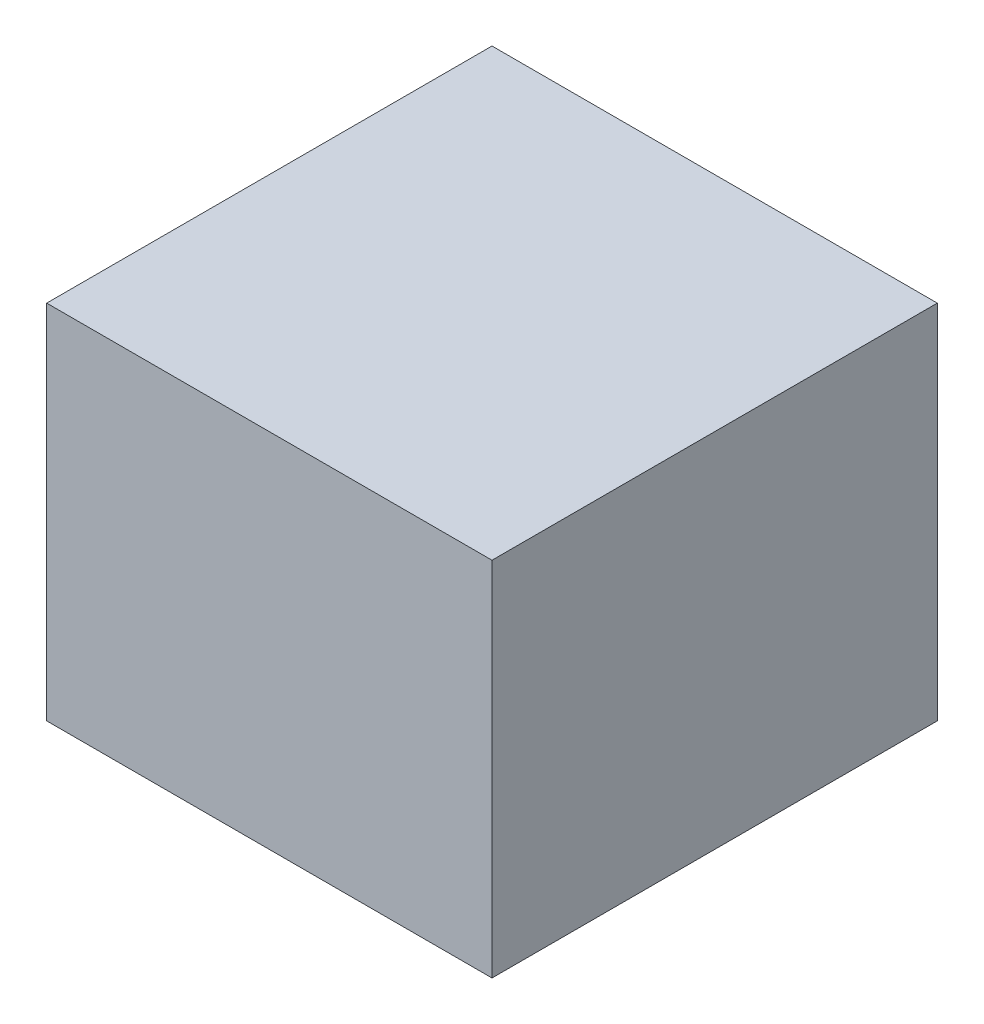
ISO-10303-21;
HEADER;
FILE_DESCRIPTION(('STEP AP214'),'2;1');
FILE_NAME('part.step','',(''),(''),'','','');
FILE_SCHEMA(('AUTOMOTIVE_DESIGN { 1 0 10303 214 1 1 1 1 }'));
ENDSEC;
DATA;
#1=APPLICATION_CONTEXT('core data for automotive mechanical design processes');
#2=APPLICATION_PROTOCOL_DEFINITION('international standard','automotive_design',2000,#1);
#3=PRODUCT_CONTEXT('',#1,'mechanical');
#4=PRODUCT('Part','Part','',(#3));
#5=PRODUCT_RELATED_PRODUCT_CATEGORY('part','',(#4));
#6=PRODUCT_DEFINITION_FORMATION('','',#4);
#7=PRODUCT_DEFINITION_CONTEXT('part definition',#1,'design');
#8=PRODUCT_DEFINITION('design','',#6,#7);
#9=PRODUCT_DEFINITION_SHAPE('','',#8);
#10=(LENGTH_UNIT() NAMED_UNIT(*) SI_UNIT(.MILLI.,.METRE.));
#11=(NAMED_UNIT(*) PLANE_ANGLE_UNIT() SI_UNIT($,.RADIAN.));
#12=(NAMED_UNIT(*) SI_UNIT($,.STERADIAN.) SOLID_ANGLE_UNIT());
#13=UNCERTAINTY_MEASURE_WITH_UNIT(LENGTH_MEASURE(1.E-05),#10,'distance_accuracy_value','');
#14=(GEOMETRIC_REPRESENTATION_CONTEXT(3) GLOBAL_UNCERTAINTY_ASSIGNED_CONTEXT((#13)) GLOBAL_UNIT_ASSIGNED_CONTEXT((#10,
#11,#12)) REPRESENTATION_CONTEXT('',''));
#15=CARTESIAN_POINT('',(0.,0.,0.));
#16=DIRECTION('',(0.,0.,1.));
#17=DIRECTION('',(1.,0.,0.));
#18=AXIS2_PLACEMENT_3D('',#15,#16,#17);
#19=CARTESIAN_POINT('',(80.,-30.,-80.));
#20=DIRECTION('',(1.,0.,0.));
#21=DIRECTION('',(0.,0.,-1.));
#22=AXIS2_PLACEMENT_3D('',#19,#20,#21);
#23=PLANE('',#22);
#24=DIRECTION('',(0.,1.,0.));
#25=VECTOR('',#24,1.);
#26=CARTESIAN_POINT('',(80.,-30.,-80.));
#27=LINE('',#26,#25);
#28=CARTESIAN_POINT('',(80.,-30.,-80.));
#29=VERTEX_POINT('',#28);
#30=CARTESIAN_POINT('',(80.,100.,-80.));
#31=VERTEX_POINT('',#30);
#32=EDGE_CURVE('E38',#29,#31,#27,.T.);
#33=ORIENTED_EDGE('',*,*,#32,.T.);
#34=DIRECTION('',(0.,0.,-1.));
#35=VECTOR('',#34,1.);
#36=CARTESIAN_POINT('',(80.,100.,-80.));
#37=LINE('',#36,#35);
#38=CARTESIAN_POINT('',(80.,100.,80.));
#39=VERTEX_POINT('',#38);
#40=EDGE_CURVE('E75',#39,#31,#37,.T.);
#41=ORIENTED_EDGE('',*,*,#40,.F.);
#42=DIRECTION('',(0.,1.,0.));
#43=VECTOR('',#42,1.);
#44=CARTESIAN_POINT('',(80.,-30.,80.));
#45=LINE('',#44,#43);
#46=CARTESIAN_POINT('',(80.,-30.,80.));
#47=VERTEX_POINT('',#46);
#48=EDGE_CURVE('E11',#47,#39,#45,.T.);
#49=ORIENTED_EDGE('',*,*,#48,.F.);
#50=DIRECTION('',(0.,0.,-1.));
#51=VECTOR('',#50,1.);
#52=CARTESIAN_POINT('',(80.,-30.,-80.));
#53=LINE('',#52,#51);
#54=EDGE_CURVE('E76',#47,#29,#53,.T.);
#55=ORIENTED_EDGE('',*,*,#54,.T.);
#56=EDGE_LOOP('',(#33,#41,#49,#55));
#57=FACE_BOUND('',#56,.T.);
#58=ADVANCED_FACE('F35',(#57),#23,.T.);
#59=CARTESIAN_POINT('',(-80.,-30.,80.));
#60=DIRECTION('',(0.,0.,1.));
#61=DIRECTION('',(1.,0.,0.));
#62=AXIS2_PLACEMENT_3D('',#59,#60,#61);
#63=PLANE('',#62);
#64=ORIENTED_EDGE('',*,*,#48,.T.);
#65=DIRECTION('',(1.,0.,0.));
#66=VECTOR('',#65,1.);
#67=CARTESIAN_POINT('',(-80.,100.,80.));
#68=LINE('',#67,#66);
#69=CARTESIAN_POINT('',(-80.,100.,80.));
#70=VERTEX_POINT('',#69);
#71=EDGE_CURVE('E92',#70,#39,#68,.T.);
#72=ORIENTED_EDGE('',*,*,#71,.F.);
#73=DIRECTION('',(0.,1.,0.));
#74=VECTOR('',#73,1.);
#75=CARTESIAN_POINT('',(-80.,-30.,80.));
#76=LINE('',#75,#74);
#77=CARTESIAN_POINT('',(-80.,-30.,80.));
#78=VERTEX_POINT('',#77);
#79=EDGE_CURVE('E43',#78,#70,#76,.T.);
#80=ORIENTED_EDGE('',*,*,#79,.F.);
#81=DIRECTION('',(1.,0.,0.));
#82=VECTOR('',#81,1.);
#83=CARTESIAN_POINT('',(-80.,-30.,80.));
#84=LINE('',#83,#82);
#85=EDGE_CURVE('E81',#78,#47,#84,.T.);
#86=ORIENTED_EDGE('',*,*,#85,.T.);
#87=EDGE_LOOP('',(#64,#72,#80,#86));
#88=FACE_BOUND('',#87,.T.);
#89=ADVANCED_FACE('F107',(#88),#63,.T.);
#90=CARTESIAN_POINT('',(-80.,-30.,-80.));
#91=DIRECTION('',(-1.,0.,0.));
#92=DIRECTION('',(0.,0.,1.));
#93=AXIS2_PLACEMENT_3D('',#90,#91,#92);
#94=PLANE('',#93);
#95=ORIENTED_EDGE('',*,*,#79,.T.);
#96=DIRECTION('',(0.,0.,1.));
#97=VECTOR('',#96,1.);
#98=CARTESIAN_POINT('',(-80.,100.,-80.));
#99=LINE('',#98,#97);
#100=CARTESIAN_POINT('',(-80.,100.,-80.));
#101=VERTEX_POINT('',#100);
#102=EDGE_CURVE('E88',#101,#70,#99,.T.);
#103=ORIENTED_EDGE('',*,*,#102,.F.);
#104=DIRECTION('',(0.,1.,0.));
#105=VECTOR('',#104,1.);
#106=CARTESIAN_POINT('',(-80.,-30.,-80.));
#107=LINE('',#106,#105);
#108=CARTESIAN_POINT('',(-80.,-30.,-80.));
#109=VERTEX_POINT('',#108);
#110=EDGE_CURVE('E80',#109,#101,#107,.T.);
#111=ORIENTED_EDGE('',*,*,#110,.F.);
#112=DIRECTION('',(0.,0.,1.));
#113=VECTOR('',#112,1.);
#114=CARTESIAN_POINT('',(-80.,-30.,-80.));
#115=LINE('',#114,#113);
#116=EDGE_CURVE('E100',#109,#78,#115,.T.);
#117=ORIENTED_EDGE('',*,*,#116,.T.);
#118=EDGE_LOOP('',(#95,#103,#111,#117));
#119=FACE_BOUND('',#118,.T.);
#120=ADVANCED_FACE('F104',(#119),#94,.T.);
#121=CARTESIAN_POINT('',(-80.,-30.,-80.));
#122=DIRECTION('',(0.,0.,-1.));
#123=DIRECTION('',(-1.,0.,0.));
#124=AXIS2_PLACEMENT_3D('',#121,#122,#123);
#125=PLANE('',#124);
#126=ORIENTED_EDGE('',*,*,#110,.T.);
#127=DIRECTION('',(-1.,0.,0.));
#128=VECTOR('',#127,1.);
#129=CARTESIAN_POINT('',(-80.,100.,-80.));
#130=LINE('',#129,#128);
#131=EDGE_CURVE('E83',#31,#101,#130,.T.);
#132=ORIENTED_EDGE('',*,*,#131,.F.);
#133=ORIENTED_EDGE('',*,*,#32,.F.);
#134=DIRECTION('',(-1.,0.,0.));
#135=VECTOR('',#134,1.);
#136=CARTESIAN_POINT('',(-80.,-30.,-80.));
#137=LINE('',#136,#135);
#138=EDGE_CURVE('E98',#29,#109,#137,.T.);
#139=ORIENTED_EDGE('',*,*,#138,.T.);
#140=EDGE_LOOP('',(#126,#132,#133,#139));
#141=FACE_BOUND('',#140,.T.);
#142=ADVANCED_FACE('F84',(#141),#125,.T.);
#143=CARTESIAN_POINT('',(0.,-30.,0.));
#144=DIRECTION('',(0.,1.,0.));
#145=DIRECTION('',(0.,0.,1.));
#146=AXIS2_PLACEMENT_3D('',#143,#144,#145);
#147=PLANE('',#146);
#148=ORIENTED_EDGE('',*,*,#54,.F.);
#149=ORIENTED_EDGE('',*,*,#85,.F.);
#150=ORIENTED_EDGE('',*,*,#116,.F.);
#151=ORIENTED_EDGE('',*,*,#138,.F.);
#152=EDGE_LOOP('',(#148,#149,#150,#151));
#153=FACE_BOUND('',#152,.T.);
#154=ADVANCED_FACE('F109',(#153),#147,.F.);
#155=CARTESIAN_POINT('',(0.,100.,0.));
#156=DIRECTION('',(0.,1.,0.));
#157=DIRECTION('',(0.,0.,1.));
#158=AXIS2_PLACEMENT_3D('',#155,#156,#157);
#159=PLANE('',#158);
#160=ORIENTED_EDGE('',*,*,#40,.T.);
#161=ORIENTED_EDGE('',*,*,#131,.T.);
#162=ORIENTED_EDGE('',*,*,#102,.T.);
#163=ORIENTED_EDGE('',*,*,#71,.T.);
#164=EDGE_LOOP('',(#160,#161,#162,#163));
#165=FACE_BOUND('',#164,.T.);
#166=ADVANCED_FACE('F91',(#165),#159,.T.);
#167=CLOSED_SHELL('',(#58,#89,#120,#142,#154,#166));
#168=MANIFOLD_SOLID_BREP('B2',#167);
#169=ADVANCED_BREP_SHAPE_REPRESENTATION('',(#18,#168),#14);
#170=SHAPE_DEFINITION_REPRESENTATION(#9,#169);
ENDSEC;
END-ISO-10303-21;
